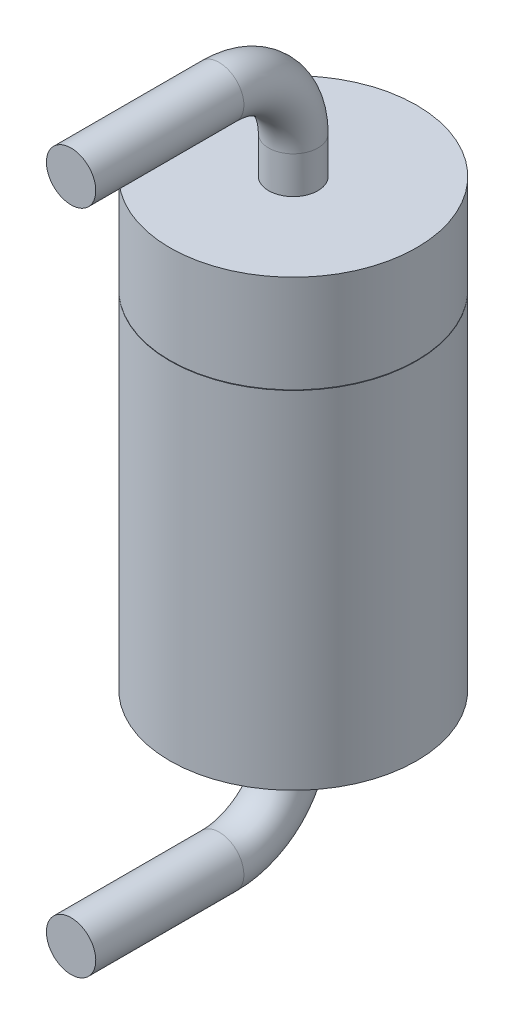
ISO-10303-21;
HEADER;
FILE_DESCRIPTION(('STEP AP214'),'2;1');
FILE_NAME('part.step','',(''),(''),'','','');
FILE_SCHEMA(('AUTOMOTIVE_DESIGN { 1 0 10303 214 1 1 1 1 }'));
ENDSEC;
DATA;
#1=APPLICATION_CONTEXT('core data for automotive mechanical design processes');
#2=APPLICATION_PROTOCOL_DEFINITION('international standard','automotive_design',2000,#1);
#3=PRODUCT_CONTEXT('',#1,'mechanical');
#4=PRODUCT('Part','Part','',(#3));
#5=PRODUCT_RELATED_PRODUCT_CATEGORY('part','',(#4));
#6=PRODUCT_DEFINITION_FORMATION('','',#4);
#7=PRODUCT_DEFINITION_CONTEXT('part definition',#1,'design');
#8=PRODUCT_DEFINITION('design','',#6,#7);
#9=PRODUCT_DEFINITION_SHAPE('','',#8);
#10=(LENGTH_UNIT() NAMED_UNIT(*) SI_UNIT(.MILLI.,.METRE.));
#11=(NAMED_UNIT(*) PLANE_ANGLE_UNIT() SI_UNIT($,.RADIAN.));
#12=(NAMED_UNIT(*) SI_UNIT($,.STERADIAN.) SOLID_ANGLE_UNIT());
#13=UNCERTAINTY_MEASURE_WITH_UNIT(LENGTH_MEASURE(1.E-05),#10,'distance_accuracy_value','');
#14=(GEOMETRIC_REPRESENTATION_CONTEXT(3) GLOBAL_UNCERTAINTY_ASSIGNED_CONTEXT((#13)) GLOBAL_UNIT_ASSIGNED_CONTEXT((#10,
#11,#12)) REPRESENTATION_CONTEXT('',''));
#15=CARTESIAN_POINT('',(0.,0.,0.));
#16=DIRECTION('',(0.,0.,1.));
#17=DIRECTION('',(1.,0.,0.));
#18=AXIS2_PLACEMENT_3D('',#15,#16,#17);
#19=CARTESIAN_POINT('',(0.,0.,0.));
#20=DIRECTION('',(0.,1.,0.));
#21=DIRECTION('',(0.,0.,1.));
#22=AXIS2_PLACEMENT_3D('',#19,#20,#21);
#23=PLANE('',#22);
#24=CARTESIAN_POINT('',(0.,0.,0.));
#25=DIRECTION('',(0.,1.,0.));
#26=DIRECTION('',(0.,0.,1.));
#27=AXIS2_PLACEMENT_3D('',#24,#25,#26);
#28=CIRCLE('',#27,2.5);
#29=CARTESIAN_POINT('',(0.,0.,2.5));
#30=VERTEX_POINT('',#29);
#31=EDGE_CURVE('E60',#30,#30,#28,.T.);
#32=ORIENTED_EDGE('',*,*,#31,.F.);
#33=EDGE_LOOP('',(#32));
#34=FACE_BOUND('',#33,.T.);
#35=CARTESIAN_POINT('',(0.,0.,0.));
#36=DIRECTION('',(0.,-1.,0.));
#37=DIRECTION('',(0.,0.,-1.));
#38=AXIS2_PLACEMENT_3D('',#35,#36,#37);
#39=CIRCLE('',#38,0.5);
#40=CARTESIAN_POINT('',(0.,0.,-0.5));
#41=VERTEX_POINT('',#40);
#42=EDGE_CURVE('E47',#41,#41,#39,.T.);
#43=ORIENTED_EDGE('',*,*,#42,.F.);
#44=EDGE_LOOP('',(#43));
#45=FACE_BOUND('',#44,.T.);
#46=ADVANCED_FACE('F39',(#34,#45),#23,.F.);
#47=CARTESIAN_POINT('',(-3.37639592011738,7.02389929314028,0.));
#48=DIRECTION('',(0.,1.,0.));
#49=DIRECTION('',(0.,0.,1.));
#50=AXIS2_PLACEMENT_3D('',#47,#48,#49);
#51=PLANE('',#50);
#52=CARTESIAN_POINT('',(0.,7.02389929314028,0.));
#53=DIRECTION('',(0.,1.,0.));
#54=DIRECTION('',(0.,0.,1.));
#55=AXIS2_PLACEMENT_3D('',#52,#53,#54);
#56=CIRCLE('',#55,2.3);
#57=CARTESIAN_POINT('',(0.,7.02389929314028,2.3));
#58=VERTEX_POINT('',#57);
#59=EDGE_CURVE('E79',#58,#58,#56,.T.);
#60=ORIENTED_EDGE('',*,*,#59,.T.);
#61=EDGE_LOOP('',(#60));
#62=FACE_BOUND('',#61,.T.);
#63=CARTESIAN_POINT('',(0.,7.02389929314028,0.));
#64=DIRECTION('',(0.,1.,0.));
#65=DIRECTION('',(0.,0.,1.));
#66=AXIS2_PLACEMENT_3D('',#63,#64,#65);
#67=CIRCLE('',#66,2.5);
#68=CARTESIAN_POINT('',(0.,7.02389929314028,2.5));
#69=VERTEX_POINT('',#68);
#70=EDGE_CURVE('E82',#69,#69,#67,.T.);
#71=ORIENTED_EDGE('',*,*,#70,.F.);
#72=EDGE_LOOP('',(#71));
#73=FACE_BOUND('',#72,.T.);
#74=ADVANCED_FACE('F111',(#62,#73),#51,.F.);
#75=CARTESIAN_POINT('',(0.,9.45,0.));
#76=DIRECTION('',(0.,1.,0.));
#77=DIRECTION('',(0.,0.,1.));
#78=AXIS2_PLACEMENT_3D('',#75,#76,#77);
#79=CYLINDRICAL_SURFACE('',#78,2.3);
#80=CARTESIAN_POINT('',(0.,7.01389929314028,0.));
#81=DIRECTION('',(0.,1.,0.));
#82=DIRECTION('',(0.,0.,1.));
#83=AXIS2_PLACEMENT_3D('',#80,#81,#82);
#84=CIRCLE('',#83,2.3);
#85=CARTESIAN_POINT('',(0.,7.01389929314028,2.3));
#86=VERTEX_POINT('',#85);
#87=EDGE_CURVE('E78',#86,#86,#84,.T.);
#88=ORIENTED_EDGE('',*,*,#87,.T.);
#89=EDGE_LOOP('',(#88));
#90=FACE_BOUND('',#89,.T.);
#91=ORIENTED_EDGE('',*,*,#59,.F.);
#92=EDGE_LOOP('',(#91));
#93=FACE_BOUND('',#92,.T.);
#94=ADVANCED_FACE('F92',(#90,#93),#79,.T.);
#95=CARTESIAN_POINT('',(0.,9.,0.));
#96=DIRECTION('',(0.,1.,0.));
#97=DIRECTION('',(0.,0.,1.));
#98=AXIS2_PLACEMENT_3D('',#95,#96,#97);
#99=PLANE('',#98);
#100=CARTESIAN_POINT('',(0.,9.,0.));
#101=DIRECTION('',(0.,1.,0.));
#102=DIRECTION('',(0.,0.,1.));
#103=AXIS2_PLACEMENT_3D('',#100,#101,#102);
#104=CIRCLE('',#103,0.5);
#105=CARTESIAN_POINT('',(0.,9.,0.5));
#106=VERTEX_POINT('',#105);
#107=EDGE_CURVE('E10',#106,#106,#104,.T.);
#108=ORIENTED_EDGE('',*,*,#107,.F.);
#109=EDGE_LOOP('',(#108));
#110=FACE_BOUND('',#109,.T.);
#111=CARTESIAN_POINT('',(0.,9.,0.));
#112=DIRECTION('',(0.,1.,0.));
#113=DIRECTION('',(0.,0.,1.));
#114=AXIS2_PLACEMENT_3D('',#111,#112,#113);
#115=CIRCLE('',#114,2.5);
#116=CARTESIAN_POINT('',(0.,9.,2.5));
#117=VERTEX_POINT('',#116);
#118=EDGE_CURVE('E53',#117,#117,#115,.T.);
#119=ORIENTED_EDGE('',*,*,#118,.T.);
#120=EDGE_LOOP('',(#119));
#121=FACE_BOUND('',#120,.T.);
#122=ADVANCED_FACE('F106',(#110,#121),#99,.T.);
#123=CARTESIAN_POINT('',(0.,9.,0.));
#124=DIRECTION('',(0.,-1.,0.));
#125=DIRECTION('',(0.,0.,-1.));
#126=AXIS2_PLACEMENT_3D('',#123,#124,#125);
#127=CYLINDRICAL_SURFACE('',#126,2.5);
#128=ORIENTED_EDGE('',*,*,#70,.T.);
#129=EDGE_LOOP('',(#128));
#130=FACE_BOUND('',#129,.T.);
#131=ORIENTED_EDGE('',*,*,#118,.F.);
#132=EDGE_LOOP('',(#131));
#133=FACE_BOUND('',#132,.T.);
#134=ADVANCED_FACE('F41',(#130,#133),#127,.T.);
#135=CARTESIAN_POINT('',(0.,7.01389929314028,0.));
#136=DIRECTION('',(0.,1.,0.));
#137=DIRECTION('',(0.,0.,1.));
#138=AXIS2_PLACEMENT_3D('',#135,#136,#137);
#139=PLANE('',#138);
#140=CARTESIAN_POINT('',(0.,7.01389929314028,0.));
#141=DIRECTION('',(0.,1.,0.));
#142=DIRECTION('',(0.,0.,1.));
#143=AXIS2_PLACEMENT_3D('',#140,#141,#142);
#144=CIRCLE('',#143,2.5);
#145=CARTESIAN_POINT('',(0.,7.01389929314028,2.5));
#146=VERTEX_POINT('',#145);
#147=EDGE_CURVE('E74',#146,#146,#144,.T.);
#148=ORIENTED_EDGE('',*,*,#147,.T.);
#149=EDGE_LOOP('',(#148));
#150=FACE_BOUND('',#149,.T.);
#151=ORIENTED_EDGE('',*,*,#87,.F.);
#152=EDGE_LOOP('',(#151));
#153=FACE_BOUND('',#152,.T.);
#154=ADVANCED_FACE('F95',(#150,#153),#139,.T.);
#155=ORIENTED_EDGE('',*,*,#31,.T.);
#156=EDGE_LOOP('',(#155));
#157=FACE_BOUND('',#156,.T.);
#158=ORIENTED_EDGE('',*,*,#147,.F.);
#159=EDGE_LOOP('',(#158));
#160=FACE_BOUND('',#159,.T.);
#161=ADVANCED_FACE('F97',(#157,#160),#127,.T.);
#162=CARTESIAN_POINT('',(0.,-2.25,1.50000000000001));
#163=DIRECTION('',(0.,0.,1.));
#164=DIRECTION('',(1.,0.,0.));
#165=AXIS2_PLACEMENT_3D('',#162,#163,#164);
#166=CYLINDRICAL_SURFACE('',#165,0.5);
#167=CARTESIAN_POINT('',(0.,-2.25,1.50000000000001));
#168=DIRECTION('',(0.,0.,1.));
#169=DIRECTION('',(0.,-1.,0.));
#170=AXIS2_PLACEMENT_3D('',#167,#168,#169);
#171=CIRCLE('',#170,0.5);
#172=CARTESIAN_POINT('',(0.,-2.75,1.50000000000001));
#173=VERTEX_POINT('',#172);
#174=EDGE_CURVE('E66',#173,#173,#171,.T.);
#175=ORIENTED_EDGE('',*,*,#174,.T.);
#176=EDGE_LOOP('',(#175));
#177=FACE_BOUND('',#176,.T.);
#178=CARTESIAN_POINT('',(0.,-2.25,4.49999999999999));
#179=DIRECTION('',(0.,0.,1.));
#180=DIRECTION('',(0.,-1.,0.));
#181=AXIS2_PLACEMENT_3D('',#178,#179,#180);
#182=CIRCLE('',#181,0.5);
#183=CARTESIAN_POINT('',(0.,-2.75,4.5));
#184=VERTEX_POINT('',#183);
#185=EDGE_CURVE('E70',#184,#184,#182,.T.);
#186=ORIENTED_EDGE('',*,*,#185,.F.);
#187=EDGE_LOOP('',(#186));
#188=FACE_BOUND('',#187,.T.);
#189=ADVANCED_FACE('F104',(#177,#188),#166,.T.);
#190=CARTESIAN_POINT('',(0.,-0.750000000000001,1.5));
#191=DIRECTION('',(-1.,0.,0.));
#192=DIRECTION('',(0.,0.,1.));
#193=AXIS2_PLACEMENT_3D('',#190,#191,#192);
#194=TOROIDAL_SURFACE('',#193,1.5,0.5);
#195=CARTESIAN_POINT('',(0.,-0.749999999999986,0.));
#196=DIRECTION('',(0.,-1.,0.));
#197=DIRECTION('',(0.,0.,-1.));
#198=AXIS2_PLACEMENT_3D('',#195,#196,#197);
#199=CIRCLE('',#198,0.5);
#200=CARTESIAN_POINT('',(0.,-0.749999999999981,-0.5));
#201=VERTEX_POINT('',#200);
#202=EDGE_CURVE('E64',#201,#201,#199,.T.);
#203=CARTESIAN_POINT('',(0.,-0.750000000000001,1.5));
#204=DIRECTION('',(-1.,0.,0.));
#205=DIRECTION('',(0.,0.,1.));
#206=AXIS2_PLACEMENT_3D('',#203,#204,#205);
#207=CIRCLE('',#206,2.);
#208=EDGE_CURVE('',#201,#173,#207,.T.);
#209=ORIENTED_EDGE('',*,*,#202,.T.);
#210=ORIENTED_EDGE('',*,*,#174,.F.);
#211=ORIENTED_EDGE('',*,*,#208,.T.);
#212=ORIENTED_EDGE('',*,*,#208,.F.);
#213=EDGE_LOOP('',(#209,#211,#210,#212));
#214=FACE_BOUND('',#213,.T.);
#215=ADVANCED_FACE('F153',(#214),#194,.T.);
#216=CARTESIAN_POINT('',(0.,-0.749999999999986,0.));
#217=DIRECTION('',(0.,1.,0.));
#218=DIRECTION('',(0.,0.,1.));
#219=AXIS2_PLACEMENT_3D('',#216,#217,#218);
#220=CYLINDRICAL_SURFACE('',#219,0.5);
#221=ORIENTED_EDGE('',*,*,#202,.F.);
#222=EDGE_LOOP('',(#221));
#223=FACE_BOUND('',#222,.T.);
#224=ORIENTED_EDGE('',*,*,#42,.T.);
#225=EDGE_LOOP('',(#224));
#226=FACE_BOUND('',#225,.T.);
#227=ADVANCED_FACE('F162',(#223,#226),#220,.T.);
#228=CARTESIAN_POINT('',(0.,-2.25,4.49999999999999));
#229=DIRECTION('',(0.,0.,1.));
#230=DIRECTION('',(0.,-1.,0.));
#231=AXIS2_PLACEMENT_3D('',#228,#229,#230);
#232=PLANE('',#231);
#233=ORIENTED_EDGE('',*,*,#185,.T.);
#234=EDGE_LOOP('',(#233));
#235=FACE_BOUND('',#234,.T.);
#236=ADVANCED_FACE('F171',(#235),#232,.T.);
#237=CARTESIAN_POINT('',(0.,11.25,1.50000000000001));
#238=DIRECTION('',(0.,0.,1.));
#239=DIRECTION('',(1.,0.,0.));
#240=AXIS2_PLACEMENT_3D('',#237,#238,#239);
#241=CYLINDRICAL_SURFACE('',#240,0.5);
#242=CARTESIAN_POINT('',(0.,11.25,1.50000000000001));
#243=DIRECTION('',(0.,0.,-1.));
#244=DIRECTION('',(0.,1.,0.));
#245=AXIS2_PLACEMENT_3D('',#242,#243,#244);
#246=CIRCLE('',#245,0.5);
#247=CARTESIAN_POINT('',(0.,11.75,1.50000000000001));
#248=VERTEX_POINT('',#247);
#249=EDGE_CURVE('E271',#248,#248,#246,.T.);
#250=ORIENTED_EDGE('',*,*,#249,.F.);
#251=EDGE_LOOP('',(#250));
#252=FACE_BOUND('',#251,.T.);
#253=CARTESIAN_POINT('',(0.,11.25,4.49999999999999));
#254=DIRECTION('',(0.,0.,-1.));
#255=DIRECTION('',(0.,1.,0.));
#256=AXIS2_PLACEMENT_3D('',#253,#254,#255);
#257=CIRCLE('',#256,0.5);
#258=CARTESIAN_POINT('',(0.,11.75,4.5));
#259=VERTEX_POINT('',#258);
#260=EDGE_CURVE('E268',#259,#259,#257,.T.);
#261=ORIENTED_EDGE('',*,*,#260,.T.);
#262=EDGE_LOOP('',(#261));
#263=FACE_BOUND('',#262,.T.);
#264=ADVANCED_FACE('F180',(#252,#263),#241,.T.);
#265=CARTESIAN_POINT('',(0.,9.75,1.5));
#266=DIRECTION('',(1.,0.,0.));
#267=DIRECTION('',(0.,0.,-1.));
#268=AXIS2_PLACEMENT_3D('',#265,#266,#267);
#269=TOROIDAL_SURFACE('',#268,1.5,0.5);
#270=CARTESIAN_POINT('',(0.,9.74999999999999,0.));
#271=DIRECTION('',(0.,-1.,0.));
#272=DIRECTION('',(0.,0.,-1.));
#273=AXIS2_PLACEMENT_3D('',#270,#271,#272);
#274=CIRCLE('',#273,0.5);
#275=CARTESIAN_POINT('',(0.,9.74999999999998,-0.5));
#276=VERTEX_POINT('',#275);
#277=EDGE_CURVE('E275',#276,#276,#274,.T.);
#278=CARTESIAN_POINT('',(0.,9.75,1.5));
#279=DIRECTION('',(1.,0.,0.));
#280=DIRECTION('',(0.,0.,-1.));
#281=AXIS2_PLACEMENT_3D('',#278,#279,#280);
#282=CIRCLE('',#281,2.);
#283=EDGE_CURVE('',#276,#248,#282,.T.);
#284=ORIENTED_EDGE('',*,*,#277,.F.);
#285=ORIENTED_EDGE('',*,*,#249,.T.);
#286=ORIENTED_EDGE('',*,*,#283,.T.);
#287=ORIENTED_EDGE('',*,*,#283,.F.);
#288=EDGE_LOOP('',(#284,#286,#285,#287));
#289=FACE_BOUND('',#288,.T.);
#290=ADVANCED_FACE('F189',(#289),#269,.T.);
#291=CARTESIAN_POINT('',(0.,9.74999999999999,0.));
#292=DIRECTION('',(0.,-1.,0.));
#293=DIRECTION('',(0.,0.,-1.));
#294=AXIS2_PLACEMENT_3D('',#291,#292,#293);
#295=CYLINDRICAL_SURFACE('',#294,0.5);
#296=ORIENTED_EDGE('',*,*,#277,.T.);
#297=EDGE_LOOP('',(#296));
#298=FACE_BOUND('',#297,.T.);
#299=ORIENTED_EDGE('',*,*,#107,.T.);
#300=EDGE_LOOP('',(#299));
#301=FACE_BOUND('',#300,.T.);
#302=ADVANCED_FACE('F198',(#298,#301),#295,.T.);
#303=CARTESIAN_POINT('',(0.,11.25,4.49999999999999));
#304=DIRECTION('',(0.,0.,1.));
#305=DIRECTION('',(0.,1.,0.));
#306=AXIS2_PLACEMENT_3D('',#303,#304,#305);
#307=PLANE('',#306);
#308=ORIENTED_EDGE('',*,*,#260,.F.);
#309=EDGE_LOOP('',(#308));
#310=FACE_BOUND('',#309,.T.);
#311=ADVANCED_FACE('F207',(#310),#307,.T.);
#312=CLOSED_SHELL('',(#46,#74,#94,#122,#134,#154,#161,#189,#215,#227,#236,#264,#290,#302,#311));
#313=MANIFOLD_SOLID_BREP('B2',#312);
#314=ADVANCED_BREP_SHAPE_REPRESENTATION('',(#18,#313),#14);
#315=SHAPE_DEFINITION_REPRESENTATION(#9,#314);
ENDSEC;
END-ISO-10303-21;
